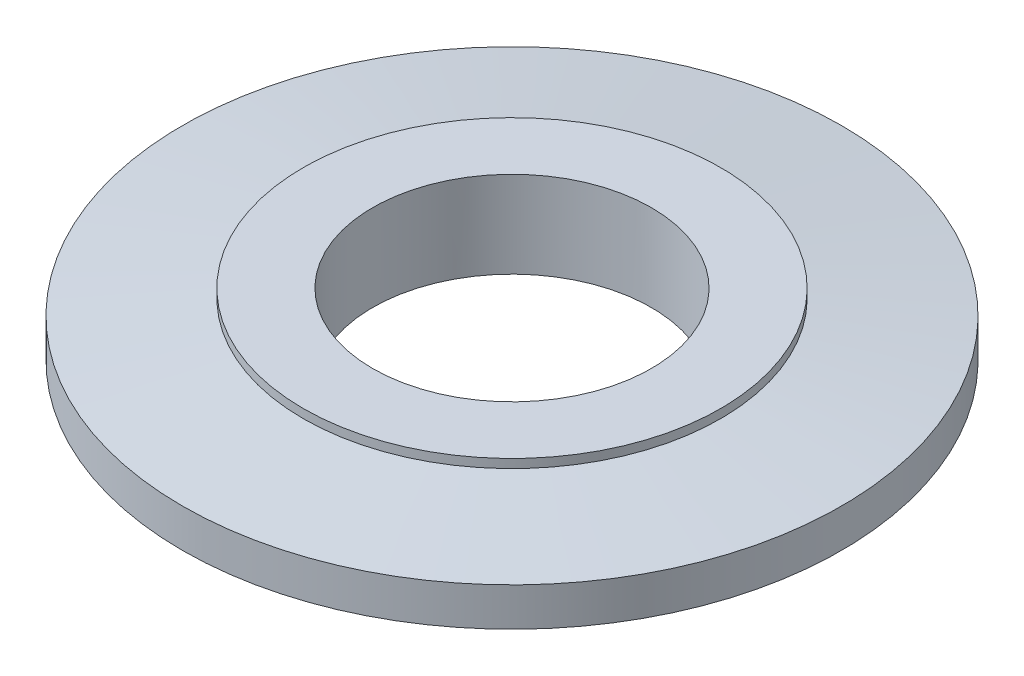
ISO-10303-21;
HEADER;
FILE_DESCRIPTION(('STEP AP214'),'2;1');
FILE_NAME('part.step','',(''),(''),'','','');
FILE_SCHEMA(('AUTOMOTIVE_DESIGN { 1 0 10303 214 1 1 1 1 }'));
ENDSEC;
DATA;
#1=APPLICATION_CONTEXT('core data for automotive mechanical design processes');
#2=APPLICATION_PROTOCOL_DEFINITION('international standard','automotive_design',2000,#1);
#3=PRODUCT_CONTEXT('',#1,'mechanical');
#4=PRODUCT('Part','Part','',(#3));
#5=PRODUCT_RELATED_PRODUCT_CATEGORY('part','',(#4));
#6=PRODUCT_DEFINITION_FORMATION('','',#4);
#7=PRODUCT_DEFINITION_CONTEXT('part definition',#1,'design');
#8=PRODUCT_DEFINITION('design','',#6,#7);
#9=PRODUCT_DEFINITION_SHAPE('','',#8);
#10=(LENGTH_UNIT() NAMED_UNIT(*) SI_UNIT(.MILLI.,.METRE.));
#11=(NAMED_UNIT(*) PLANE_ANGLE_UNIT() SI_UNIT($,.RADIAN.));
#12=(NAMED_UNIT(*) SI_UNIT($,.STERADIAN.) SOLID_ANGLE_UNIT());
#13=UNCERTAINTY_MEASURE_WITH_UNIT(LENGTH_MEASURE(1.E-05),#10,'distance_accuracy_value','');
#14=(GEOMETRIC_REPRESENTATION_CONTEXT(3) GLOBAL_UNCERTAINTY_ASSIGNED_CONTEXT((#13)) GLOBAL_UNIT_ASSIGNED_CONTEXT((#10,
#11,#12)) REPRESENTATION_CONTEXT('',''));
#15=CARTESIAN_POINT('',(0.,0.,0.));
#16=DIRECTION('',(0.,0.,1.));
#17=DIRECTION('',(1.,0.,0.));
#18=AXIS2_PLACEMENT_3D('',#15,#16,#17);
#19=CARTESIAN_POINT('',(0.,-1.575,0.));
#20=DIRECTION('',(0.,1.,0.));
#21=DIRECTION('',(0.,0.,1.));
#22=AXIS2_PLACEMENT_3D('',#19,#20,#21);
#23=PLANE('',#22);
#24=CARTESIAN_POINT('',(0.,-1.575,0.));
#25=DIRECTION('',(0.,1.,0.));
#26=DIRECTION('',(0.,0.,1.));
#27=AXIS2_PLACEMENT_3D('',#24,#25,#26);
#28=CIRCLE('',#27,5.075);
#29=CARTESIAN_POINT('',(0.,-1.575,5.075));
#30=VERTEX_POINT('',#29);
#31=EDGE_CURVE('E73',#30,#30,#28,.T.);
#32=ORIENTED_EDGE('',*,*,#31,.T.);
#33=EDGE_LOOP('',(#32));
#34=FACE_BOUND('',#33,.T.);
#35=CARTESIAN_POINT('',(0.,-1.575,0.));
#36=DIRECTION('',(0.,1.,0.));
#37=DIRECTION('',(0.,0.,1.));
#38=AXIS2_PLACEMENT_3D('',#35,#36,#37);
#39=CIRCLE('',#38,7.6);
#40=CARTESIAN_POINT('',(0.,-1.575,7.6));
#41=VERTEX_POINT('',#40);
#42=EDGE_CURVE('E10',#41,#41,#39,.T.);
#43=ORIENTED_EDGE('',*,*,#42,.F.);
#44=EDGE_LOOP('',(#43));
#45=FACE_BOUND('',#44,.T.);
#46=ADVANCED_FACE('F42',(#34,#45),#23,.F.);
#47=CARTESIAN_POINT('',(0.,11.1167384225633,0.));
#48=DIRECTION('',(0.,1.,0.));
#49=DIRECTION('',(0.,0.,1.));
#50=AXIS2_PLACEMENT_3D('',#47,#48,#49);
#51=CYLINDRICAL_SURFACE('',#50,7.6);
#52=CARTESIAN_POINT('',(0.,-1.255,0.));
#53=DIRECTION('',(0.,1.,0.));
#54=DIRECTION('',(0.,0.,1.));
#55=AXIS2_PLACEMENT_3D('',#52,#53,#54);
#56=CIRCLE('',#55,7.6);
#57=CARTESIAN_POINT('',(0.,-1.255,7.6));
#58=VERTEX_POINT('',#57);
#59=EDGE_CURVE('E50',#58,#58,#56,.T.);
#60=ORIENTED_EDGE('',*,*,#59,.F.);
#61=EDGE_LOOP('',(#60));
#62=FACE_BOUND('',#61,.T.);
#63=ORIENTED_EDGE('',*,*,#42,.T.);
#64=EDGE_LOOP('',(#63));
#65=FACE_BOUND('',#64,.T.);
#66=ADVANCED_FACE('F95',(#62,#65),#51,.T.);
#67=CARTESIAN_POINT('',(0.,-1.255,0.));
#68=DIRECTION('',(0.,1.,0.));
#69=DIRECTION('',(0.,0.,1.));
#70=AXIS2_PLACEMENT_3D('',#67,#68,#69);
#71=CONICAL_SURFACE('',#70,7.6,1.44532260806095);
#72=CARTESIAN_POINT('',(0.,-0.699999999999999,0.));
#73=DIRECTION('',(0.,1.,0.));
#74=DIRECTION('',(0.,0.,1.));
#75=AXIS2_PLACEMENT_3D('',#72,#73,#74);
#76=CIRCLE('',#75,12.);
#77=CARTESIAN_POINT('',(0.,-0.699999999999999,12.));
#78=VERTEX_POINT('',#77);
#79=EDGE_CURVE('E55',#78,#78,#76,.T.);
#80=ORIENTED_EDGE('',*,*,#79,.F.);
#81=EDGE_LOOP('',(#80));
#82=FACE_BOUND('',#81,.T.);
#83=ORIENTED_EDGE('',*,*,#59,.T.);
#84=EDGE_LOOP('',(#83));
#85=FACE_BOUND('',#84,.T.);
#86=ADVANCED_FACE('F99',(#82,#85),#71,.T.);
#87=CARTESIAN_POINT('',(0.,11.1167384225633,0.));
#88=DIRECTION('',(0.,1.,0.));
#89=DIRECTION('',(0.,0.,1.));
#90=AXIS2_PLACEMENT_3D('',#87,#88,#89);
#91=CYLINDRICAL_SURFACE('',#90,12.);
#92=CARTESIAN_POINT('',(0.,0.699999999999999,0.));
#93=DIRECTION('',(0.,1.,0.));
#94=DIRECTION('',(0.,0.,1.));
#95=AXIS2_PLACEMENT_3D('',#92,#93,#94);
#96=CIRCLE('',#95,12.);
#97=CARTESIAN_POINT('',(0.,0.699999999999999,12.));
#98=VERTEX_POINT('',#97);
#99=EDGE_CURVE('E61',#98,#98,#96,.T.);
#100=ORIENTED_EDGE('',*,*,#99,.F.);
#101=EDGE_LOOP('',(#100));
#102=FACE_BOUND('',#101,.T.);
#103=ORIENTED_EDGE('',*,*,#79,.T.);
#104=EDGE_LOOP('',(#103));
#105=FACE_BOUND('',#104,.T.);
#106=ADVANCED_FACE('F105',(#102,#105),#91,.T.);
#107=CARTESIAN_POINT('',(0.,0.699999999999999,0.));
#108=DIRECTION('',(0.,-1.,0.));
#109=DIRECTION('',(0.,0.,-1.));
#110=AXIS2_PLACEMENT_3D('',#107,#108,#109);
#111=CONICAL_SURFACE('',#110,12.,1.44532260806095);
#112=CARTESIAN_POINT('',(0.,1.255,0.));
#113=DIRECTION('',(0.,1.,0.));
#114=DIRECTION('',(0.,0.,1.));
#115=AXIS2_PLACEMENT_3D('',#112,#113,#114);
#116=CIRCLE('',#115,7.6);
#117=CARTESIAN_POINT('',(0.,1.255,7.6));
#118=VERTEX_POINT('',#117);
#119=EDGE_CURVE('E65',#118,#118,#116,.T.);
#120=ORIENTED_EDGE('',*,*,#119,.F.);
#121=EDGE_LOOP('',(#120));
#122=FACE_BOUND('',#121,.T.);
#123=ORIENTED_EDGE('',*,*,#99,.T.);
#124=EDGE_LOOP('',(#123));
#125=FACE_BOUND('',#124,.T.);
#126=ADVANCED_FACE('F112',(#122,#125),#111,.T.);
#127=CARTESIAN_POINT('',(0.,11.1167384225633,0.));
#128=DIRECTION('',(0.,1.,0.));
#129=DIRECTION('',(0.,0.,1.));
#130=AXIS2_PLACEMENT_3D('',#127,#128,#129);
#131=CYLINDRICAL_SURFACE('',#130,7.6);
#132=CARTESIAN_POINT('',(0.,1.575,0.));
#133=DIRECTION('',(0.,1.,0.));
#134=DIRECTION('',(0.,0.,1.));
#135=AXIS2_PLACEMENT_3D('',#132,#133,#134);
#136=CIRCLE('',#135,7.6);
#137=CARTESIAN_POINT('',(0.,1.575,7.6));
#138=VERTEX_POINT('',#137);
#139=EDGE_CURVE('E69',#138,#138,#136,.T.);
#140=ORIENTED_EDGE('',*,*,#139,.F.);
#141=EDGE_LOOP('',(#140));
#142=FACE_BOUND('',#141,.T.);
#143=ORIENTED_EDGE('',*,*,#119,.T.);
#144=EDGE_LOOP('',(#143));
#145=FACE_BOUND('',#144,.T.);
#146=ADVANCED_FACE('F92',(#142,#145),#131,.T.);
#147=CARTESIAN_POINT('',(0.,1.575,0.));
#148=DIRECTION('',(0.,-1.,0.));
#149=DIRECTION('',(0.,0.,-1.));
#150=AXIS2_PLACEMENT_3D('',#147,#148,#149);
#151=PLANE('',#150);
#152=CARTESIAN_POINT('',(0.,1.575,0.));
#153=DIRECTION('',(0.,-1.,0.));
#154=DIRECTION('',(0.,0.,-1.));
#155=AXIS2_PLACEMENT_3D('',#152,#153,#154);
#156=CIRCLE('',#155,5.075);
#157=CARTESIAN_POINT('',(0.,1.575,-5.075));
#158=VERTEX_POINT('',#157);
#159=EDGE_CURVE('E45',#158,#158,#156,.T.);
#160=ORIENTED_EDGE('',*,*,#159,.T.);
#161=EDGE_LOOP('',(#160));
#162=FACE_BOUND('',#161,.T.);
#163=ORIENTED_EDGE('',*,*,#139,.T.);
#164=EDGE_LOOP('',(#163));
#165=FACE_BOUND('',#164,.T.);
#166=ADVANCED_FACE('F82',(#162,#165),#151,.F.);
#167=CARTESIAN_POINT('',(0.,-1.575,0.));
#168=DIRECTION('',(0.,1.,0.));
#169=DIRECTION('',(0.,0.,1.));
#170=AXIS2_PLACEMENT_3D('',#167,#168,#169);
#171=CYLINDRICAL_SURFACE('',#170,5.075);
#172=ORIENTED_EDGE('',*,*,#31,.F.);
#173=EDGE_LOOP('',(#172));
#174=FACE_BOUND('',#173,.T.);
#175=ORIENTED_EDGE('',*,*,#159,.F.);
#176=EDGE_LOOP('',(#175));
#177=FACE_BOUND('',#176,.T.);
#178=ADVANCED_FACE('F85',(#174,#177),#171,.F.);
#179=CLOSED_SHELL('',(#46,#66,#86,#106,#126,#146,#166,#178));
#180=MANIFOLD_SOLID_BREP('B2',#179);
#181=ADVANCED_BREP_SHAPE_REPRESENTATION('',(#18,#180),#14);
#182=SHAPE_DEFINITION_REPRESENTATION(#9,#181);
ENDSEC;
END-ISO-10303-21;
